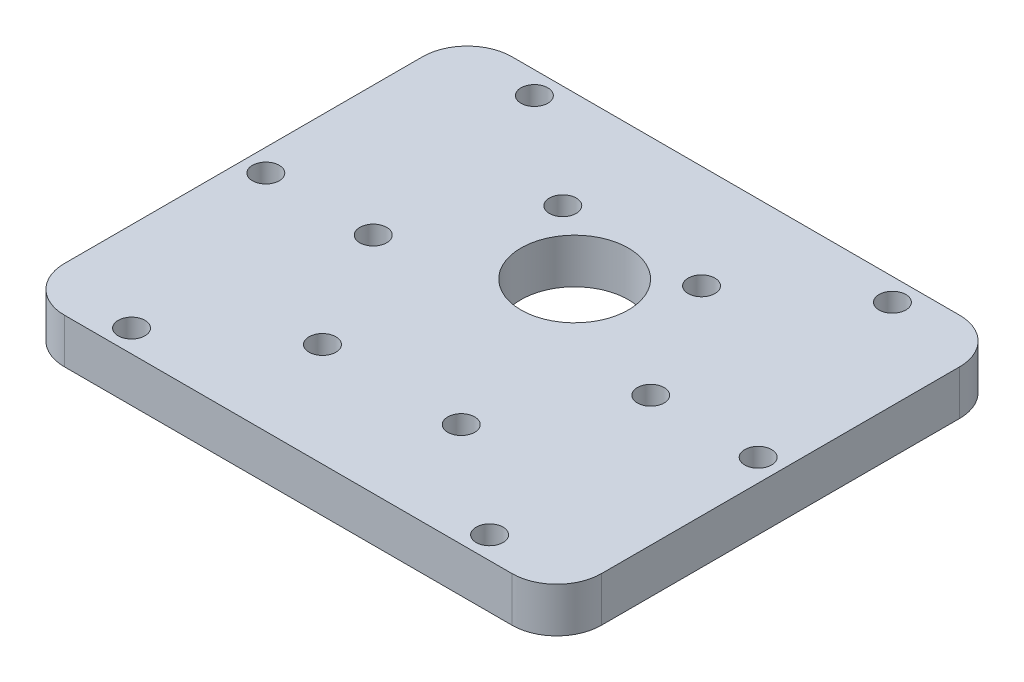
ISO-10303-21;
HEADER;
FILE_DESCRIPTION(('STEP AP214'),'2;1');
FILE_NAME('part.step','',(''),(''),'','','');
FILE_SCHEMA(('AUTOMOTIVE_DESIGN { 1 0 10303 214 1 1 1 1 }'));
ENDSEC;
DATA;
#1=APPLICATION_CONTEXT('core data for automotive mechanical design processes');
#2=APPLICATION_PROTOCOL_DEFINITION('international standard','automotive_design',2000,#1);
#3=PRODUCT_CONTEXT('',#1,'mechanical');
#4=PRODUCT('Part','Part','',(#3));
#5=PRODUCT_RELATED_PRODUCT_CATEGORY('part','',(#4));
#6=PRODUCT_DEFINITION_FORMATION('','',#4);
#7=PRODUCT_DEFINITION_CONTEXT('part definition',#1,'design');
#8=PRODUCT_DEFINITION('design','',#6,#7);
#9=PRODUCT_DEFINITION_SHAPE('','',#8);
#10=(LENGTH_UNIT() NAMED_UNIT(*) SI_UNIT(.MILLI.,.METRE.));
#11=(NAMED_UNIT(*) PLANE_ANGLE_UNIT() SI_UNIT($,.RADIAN.));
#12=(NAMED_UNIT(*) SI_UNIT($,.STERADIAN.) SOLID_ANGLE_UNIT());
#13=UNCERTAINTY_MEASURE_WITH_UNIT(LENGTH_MEASURE(1.E-05),#10,'distance_accuracy_value','');
#14=(GEOMETRIC_REPRESENTATION_CONTEXT(3) GLOBAL_UNCERTAINTY_ASSIGNED_CONTEXT((#13)) GLOBAL_UNIT_ASSIGNED_CONTEXT((#10,
#11,#12)) REPRESENTATION_CONTEXT('',''));
#15=CARTESIAN_POINT('',(0.,0.,0.));
#16=DIRECTION('',(0.,0.,1.));
#17=DIRECTION('',(1.,0.,0.));
#18=AXIS2_PLACEMENT_3D('',#15,#16,#17);
#19=CARTESIAN_POINT('',(30.,5.,-25.));
#20=DIRECTION('',(-1.,0.,0.));
#21=DIRECTION('',(0.,0.,1.));
#22=AXIS2_PLACEMENT_3D('',#19,#20,#21);
#23=PLANE('',#22);
#24=DIRECTION('',(0.,0.,-1.));
#25=VECTOR('',#24,1.);
#26=CARTESIAN_POINT('',(30.,5.,-25.));
#27=LINE('',#26,#25);
#28=CARTESIAN_POINT('',(30.,5.,20.));
#29=VERTEX_POINT('',#28);
#30=CARTESIAN_POINT('',(30.,5.,-20.));
#31=VERTEX_POINT('',#30);
#32=EDGE_CURVE('E134',#29,#31,#27,.T.);
#33=ORIENTED_EDGE('',*,*,#32,.F.);
#34=DIRECTION('',(0.,-1.,0.));
#35=VECTOR('',#34,1.);
#36=CARTESIAN_POINT('',(30.,5.,20.));
#37=LINE('',#36,#35);
#38=CARTESIAN_POINT('',(30.,0.,20.));
#39=VERTEX_POINT('',#38);
#40=EDGE_CURVE('E173',#29,#39,#37,.T.);
#41=ORIENTED_EDGE('',*,*,#40,.T.);
#42=DIRECTION('',(0.,0.,-1.));
#43=VECTOR('',#42,1.);
#44=CARTESIAN_POINT('',(30.,0.,-25.));
#45=LINE('',#44,#43);
#46=CARTESIAN_POINT('',(30.,0.,-20.));
#47=VERTEX_POINT('',#46);
#48=EDGE_CURVE('E188',#39,#47,#45,.T.);
#49=ORIENTED_EDGE('',*,*,#48,.T.);
#50=DIRECTION('',(0.,-1.,0.));
#51=VECTOR('',#50,1.);
#52=CARTESIAN_POINT('',(30.,5.,-20.));
#53=LINE('',#52,#51);
#54=EDGE_CURVE('E170',#47,#31,#53,.F.);
#55=ORIENTED_EDGE('',*,*,#54,.T.);
#56=EDGE_LOOP('',(#33,#41,#49,#55));
#57=FACE_BOUND('',#56,.T.);
#58=ADVANCED_FACE('F38',(#57),#23,.F.);
#59=CARTESIAN_POINT('',(-30.,5.,-25.));
#60=DIRECTION('',(0.,0.,1.));
#61=DIRECTION('',(1.,0.,0.));
#62=AXIS2_PLACEMENT_3D('',#59,#60,#61);
#63=PLANE('',#62);
#64=DIRECTION('',(-1.,0.,0.));
#65=VECTOR('',#64,1.);
#66=CARTESIAN_POINT('',(-30.,5.,-25.));
#67=LINE('',#66,#65);
#68=CARTESIAN_POINT('',(25.,5.,-25.));
#69=VERTEX_POINT('',#68);
#70=CARTESIAN_POINT('',(-25.,5.,-25.));
#71=VERTEX_POINT('',#70);
#72=EDGE_CURVE('E139',#69,#71,#67,.T.);
#73=ORIENTED_EDGE('',*,*,#72,.F.);
#74=DIRECTION('',(0.,-1.,0.));
#75=VECTOR('',#74,1.);
#76=CARTESIAN_POINT('',(25.,5.,-25.));
#77=LINE('',#76,#75);
#78=CARTESIAN_POINT('',(25.,0.,-25.));
#79=VERTEX_POINT('',#78);
#80=EDGE_CURVE('E11',#69,#79,#77,.T.);
#81=ORIENTED_EDGE('',*,*,#80,.T.);
#82=DIRECTION('',(-1.,0.,0.));
#83=VECTOR('',#82,1.);
#84=CARTESIAN_POINT('',(-30.,0.,-25.));
#85=LINE('',#84,#83);
#86=CARTESIAN_POINT('',(-25.,0.,-25.));
#87=VERTEX_POINT('',#86);
#88=EDGE_CURVE('E141',#79,#87,#85,.T.);
#89=ORIENTED_EDGE('',*,*,#88,.T.);
#90=DIRECTION('',(0.,-1.,0.));
#91=VECTOR('',#90,1.);
#92=CARTESIAN_POINT('',(-25.,5.,-25.));
#93=LINE('',#92,#91);
#94=EDGE_CURVE('E47',#87,#71,#93,.F.);
#95=ORIENTED_EDGE('',*,*,#94,.T.);
#96=EDGE_LOOP('',(#73,#81,#89,#95));
#97=FACE_BOUND('',#96,.T.);
#98=ADVANCED_FACE('F194',(#97),#63,.F.);
#99=CARTESIAN_POINT('',(-30.,5.,-25.));
#100=DIRECTION('',(1.,0.,0.));
#101=DIRECTION('',(0.,0.,-1.));
#102=AXIS2_PLACEMENT_3D('',#99,#100,#101);
#103=PLANE('',#102);
#104=DIRECTION('',(0.,0.,1.));
#105=VECTOR('',#104,1.);
#106=CARTESIAN_POINT('',(-30.,0.,-25.));
#107=LINE('',#106,#105);
#108=CARTESIAN_POINT('',(-30.,0.,-20.));
#109=VERTEX_POINT('',#108);
#110=CARTESIAN_POINT('',(-30.,0.,20.));
#111=VERTEX_POINT('',#110);
#112=EDGE_CURVE('E135',#109,#111,#107,.T.);
#113=ORIENTED_EDGE('',*,*,#112,.T.);
#114=DIRECTION('',(0.,-1.,0.));
#115=VECTOR('',#114,1.);
#116=CARTESIAN_POINT('',(-30.,5.,20.));
#117=LINE('',#116,#115);
#118=CARTESIAN_POINT('',(-30.,5.,20.));
#119=VERTEX_POINT('',#118);
#120=EDGE_CURVE('E110',#111,#119,#117,.F.);
#121=ORIENTED_EDGE('',*,*,#120,.T.);
#122=DIRECTION('',(0.,0.,1.));
#123=VECTOR('',#122,1.);
#124=CARTESIAN_POINT('',(-30.,5.,-25.));
#125=LINE('',#124,#123);
#126=CARTESIAN_POINT('',(-30.,5.,-20.));
#127=VERTEX_POINT('',#126);
#128=EDGE_CURVE('E179',#127,#119,#125,.T.);
#129=ORIENTED_EDGE('',*,*,#128,.F.);
#130=DIRECTION('',(0.,-1.,0.));
#131=VECTOR('',#130,1.);
#132=CARTESIAN_POINT('',(-30.,5.,-20.));
#133=LINE('',#132,#131);
#134=EDGE_CURVE('E116',#127,#109,#133,.T.);
#135=ORIENTED_EDGE('',*,*,#134,.T.);
#136=EDGE_LOOP('',(#113,#121,#129,#135));
#137=FACE_BOUND('',#136,.T.);
#138=ADVANCED_FACE('F201',(#137),#103,.F.);
#139=CARTESIAN_POINT('',(-30.,5.,25.));
#140=DIRECTION('',(0.,0.,-1.));
#141=DIRECTION('',(-1.,0.,0.));
#142=AXIS2_PLACEMENT_3D('',#139,#140,#141);
#143=PLANE('',#142);
#144=DIRECTION('',(1.,0.,0.));
#145=VECTOR('',#144,1.);
#146=CARTESIAN_POINT('',(-30.,5.,25.));
#147=LINE('',#146,#145);
#148=CARTESIAN_POINT('',(-25.,5.,25.));
#149=VERTEX_POINT('',#148);
#150=CARTESIAN_POINT('',(25.,5.,25.));
#151=VERTEX_POINT('',#150);
#152=EDGE_CURVE('E126',#149,#151,#147,.T.);
#153=ORIENTED_EDGE('',*,*,#152,.F.);
#154=DIRECTION('',(0.,-1.,0.));
#155=VECTOR('',#154,1.);
#156=CARTESIAN_POINT('',(-25.,5.,25.));
#157=LINE('',#156,#155);
#158=CARTESIAN_POINT('',(-25.,0.,25.));
#159=VERTEX_POINT('',#158);
#160=EDGE_CURVE('E109',#149,#159,#157,.T.);
#161=ORIENTED_EDGE('',*,*,#160,.T.);
#162=DIRECTION('',(1.,0.,0.));
#163=VECTOR('',#162,1.);
#164=CARTESIAN_POINT('',(-30.,0.,25.));
#165=LINE('',#164,#163);
#166=CARTESIAN_POINT('',(25.,0.,25.));
#167=VERTEX_POINT('',#166);
#168=EDGE_CURVE('E123',#159,#167,#165,.T.);
#169=ORIENTED_EDGE('',*,*,#168,.T.);
#170=DIRECTION('',(0.,-1.,0.));
#171=VECTOR('',#170,1.);
#172=CARTESIAN_POINT('',(25.,5.,25.));
#173=LINE('',#172,#171);
#174=EDGE_CURVE('E129',#167,#151,#173,.F.);
#175=ORIENTED_EDGE('',*,*,#174,.T.);
#176=EDGE_LOOP('',(#153,#161,#169,#175));
#177=FACE_BOUND('',#176,.T.);
#178=ADVANCED_FACE('F122',(#177),#143,.F.);
#179=CARTESIAN_POINT('',(0.,5.,0.));
#180=DIRECTION('',(0.,1.,0.));
#181=DIRECTION('',(0.,0.,1.));
#182=AXIS2_PLACEMENT_3D('',#179,#180,#181);
#183=PLANE('',#182);
#184=CARTESIAN_POINT('',(15.5,5.,0.));
#185=DIRECTION('',(0.,1.,0.));
#186=DIRECTION('',(0.,0.,1.));
#187=AXIS2_PLACEMENT_3D('',#184,#185,#186);
#188=CIRCLE('',#187,1.5);
#189=CARTESIAN_POINT('',(15.5,5.,1.5));
#190=VERTEX_POINT('',#189);
#191=EDGE_CURVE('E427',#190,#190,#188,.T.);
#192=ORIENTED_EDGE('',*,*,#191,.F.);
#193=EDGE_LOOP('',(#192));
#194=FACE_BOUND('',#193,.T.);
#195=CARTESIAN_POINT('',(7.74999999999997,5.,13.4233937586588));
#196=DIRECTION('',(0.,1.,0.));
#197=DIRECTION('',(0.,0.,1.));
#198=AXIS2_PLACEMENT_3D('',#195,#196,#197);
#199=CIRCLE('',#198,1.5);
#200=CARTESIAN_POINT('',(7.74999999999997,5.,14.9233937586588));
#201=VERTEX_POINT('',#200);
#202=EDGE_CURVE('E433',#201,#201,#199,.T.);
#203=ORIENTED_EDGE('',*,*,#202,.F.);
#204=EDGE_LOOP('',(#203));
#205=FACE_BOUND('',#204,.T.);
#206=CARTESIAN_POINT('',(-7.75000000000006,5.,13.4233937586588));
#207=DIRECTION('',(0.,1.,0.));
#208=DIRECTION('',(0.,0.,1.));
#209=AXIS2_PLACEMENT_3D('',#206,#207,#208);
#210=CIRCLE('',#209,1.5);
#211=CARTESIAN_POINT('',(-7.75000000000006,5.,14.9233937586588));
#212=VERTEX_POINT('',#211);
#213=EDGE_CURVE('E492',#212,#212,#210,.T.);
#214=ORIENTED_EDGE('',*,*,#213,.F.);
#215=EDGE_LOOP('',(#214));
#216=FACE_BOUND('',#215,.T.);
#217=CARTESIAN_POINT('',(-20.,5.,22.5));
#218=DIRECTION('',(0.,1.,0.));
#219=DIRECTION('',(0.,0.,1.));
#220=AXIS2_PLACEMENT_3D('',#217,#218,#219);
#221=CIRCLE('',#220,1.5);
#222=CARTESIAN_POINT('',(-20.,5.,24.));
#223=VERTEX_POINT('',#222);
#224=EDGE_CURVE('E484',#223,#223,#221,.T.);
#225=ORIENTED_EDGE('',*,*,#224,.F.);
#226=EDGE_LOOP('',(#225));
#227=FACE_BOUND('',#226,.T.);
#228=CARTESIAN_POINT('',(-15.5,5.,0.));
#229=DIRECTION('',(0.,1.,0.));
#230=DIRECTION('',(0.,0.,1.));
#231=AXIS2_PLACEMENT_3D('',#228,#229,#230);
#232=CIRCLE('',#231,1.5);
#233=CARTESIAN_POINT('',(-15.5,5.,1.5));
#234=VERTEX_POINT('',#233);
#235=EDGE_CURVE('E469',#234,#234,#232,.T.);
#236=ORIENTED_EDGE('',*,*,#235,.F.);
#237=EDGE_LOOP('',(#236));
#238=FACE_BOUND('',#237,.T.);
#239=CARTESIAN_POINT('',(-7.74999999999997,5.,-13.4233937586588));
#240=DIRECTION('',(0.,1.,0.));
#241=DIRECTION('',(0.,0.,1.));
#242=AXIS2_PLACEMENT_3D('',#239,#240,#241);
#243=CIRCLE('',#242,1.5);
#244=CARTESIAN_POINT('',(-7.74999999999997,5.,-11.9233937586588));
#245=VERTEX_POINT('',#244);
#246=EDGE_CURVE('E461',#245,#245,#243,.T.);
#247=ORIENTED_EDGE('',*,*,#246,.F.);
#248=EDGE_LOOP('',(#247));
#249=FACE_BOUND('',#248,.T.);
#250=CARTESIAN_POINT('',(0.,5.,-7.));
#251=DIRECTION('',(0.,1.,0.));
#252=DIRECTION('',(0.,0.,1.));
#253=AXIS2_PLACEMENT_3D('',#250,#251,#252);
#254=CIRCLE('',#253,6.);
#255=CARTESIAN_POINT('',(0.,5.,-0.999999999999999));
#256=VERTEX_POINT('',#255);
#257=EDGE_CURVE('E453',#256,#256,#254,.T.);
#258=ORIENTED_EDGE('',*,*,#257,.F.);
#259=EDGE_LOOP('',(#258));
#260=FACE_BOUND('',#259,.T.);
#261=CARTESIAN_POINT('',(20.,5.,22.5));
#262=DIRECTION('',(0.,1.,0.));
#263=DIRECTION('',(0.,0.,1.));
#264=AXIS2_PLACEMENT_3D('',#261,#262,#263);
#265=CIRCLE('',#264,1.5);
#266=CARTESIAN_POINT('',(20.,5.,24.));
#267=VERTEX_POINT('',#266);
#268=EDGE_CURVE('E445',#267,#267,#265,.T.);
#269=ORIENTED_EDGE('',*,*,#268,.F.);
#270=EDGE_LOOP('',(#269));
#271=FACE_BOUND('',#270,.T.);
#272=CARTESIAN_POINT('',(7.75000000000006,5.,-13.4233937586588));
#273=DIRECTION('',(0.,1.,0.));
#274=DIRECTION('',(0.,0.,1.));
#275=AXIS2_PLACEMENT_3D('',#272,#273,#274);
#276=CIRCLE('',#275,1.5);
#277=CARTESIAN_POINT('',(7.75000000000006,5.,-11.9233937586588));
#278=VERTEX_POINT('',#277);
#279=EDGE_CURVE('E436',#278,#278,#276,.T.);
#280=ORIENTED_EDGE('',*,*,#279,.F.);
#281=EDGE_LOOP('',(#280));
#282=FACE_BOUND('',#281,.T.);
#283=CARTESIAN_POINT('',(-20.,5.,-22.5));
#284=DIRECTION('',(0.,1.,0.));
#285=DIRECTION('',(0.,0.,1.));
#286=AXIS2_PLACEMENT_3D('',#283,#284,#285);
#287=CIRCLE('',#286,1.5);
#288=CARTESIAN_POINT('',(-20.,5.,-21.));
#289=VERTEX_POINT('',#288);
#290=EDGE_CURVE('E521',#289,#289,#287,.T.);
#291=ORIENTED_EDGE('',*,*,#290,.F.);
#292=EDGE_LOOP('',(#291));
#293=FACE_BOUND('',#292,.T.);
#294=CARTESIAN_POINT('',(-27.5,5.,0.));
#295=DIRECTION('',(0.,1.,0.));
#296=DIRECTION('',(0.,0.,1.));
#297=AXIS2_PLACEMENT_3D('',#294,#295,#296);
#298=CIRCLE('',#297,1.5);
#299=CARTESIAN_POINT('',(-27.5,5.,1.5));
#300=VERTEX_POINT('',#299);
#301=EDGE_CURVE('E513',#300,#300,#298,.T.);
#302=ORIENTED_EDGE('',*,*,#301,.F.);
#303=EDGE_LOOP('',(#302));
#304=FACE_BOUND('',#303,.T.);
#305=CARTESIAN_POINT('',(27.5,5.,0.));
#306=DIRECTION('',(0.,1.,0.));
#307=DIRECTION('',(0.,0.,1.));
#308=AXIS2_PLACEMENT_3D('',#305,#306,#307);
#309=CIRCLE('',#308,1.5);
#310=CARTESIAN_POINT('',(27.5,5.,1.5));
#311=VERTEX_POINT('',#310);
#312=EDGE_CURVE('E505',#311,#311,#309,.T.);
#313=ORIENTED_EDGE('',*,*,#312,.F.);
#314=EDGE_LOOP('',(#313));
#315=FACE_BOUND('',#314,.T.);
#316=CARTESIAN_POINT('',(20.,5.,-22.5));
#317=DIRECTION('',(0.,1.,0.));
#318=DIRECTION('',(0.,0.,1.));
#319=AXIS2_PLACEMENT_3D('',#316,#317,#318);
#320=CIRCLE('',#319,1.5);
#321=CARTESIAN_POINT('',(20.,5.,-21.));
#322=VERTEX_POINT('',#321);
#323=EDGE_CURVE('E444',#322,#322,#320,.T.);
#324=ORIENTED_EDGE('',*,*,#323,.F.);
#325=EDGE_LOOP('',(#324));
#326=FACE_BOUND('',#325,.T.);
#327=ORIENTED_EDGE('',*,*,#128,.T.);
#328=CARTESIAN_POINT('',(-25.,5.,20.));
#329=DIRECTION('',(0.,1.,0.));
#330=DIRECTION('',(0.,0.,1.));
#331=AXIS2_PLACEMENT_3D('',#328,#329,#330);
#332=CIRCLE('',#331,5.);
#333=EDGE_CURVE('E167',#119,#149,#332,.T.);
#334=ORIENTED_EDGE('',*,*,#333,.T.);
#335=ORIENTED_EDGE('',*,*,#152,.T.);
#336=CARTESIAN_POINT('',(25.,5.,20.));
#337=DIRECTION('',(0.,1.,0.));
#338=DIRECTION('',(0.,0.,1.));
#339=AXIS2_PLACEMENT_3D('',#336,#337,#338);
#340=CIRCLE('',#339,5.);
#341=EDGE_CURVE('E164',#151,#29,#340,.T.);
#342=ORIENTED_EDGE('',*,*,#341,.T.);
#343=ORIENTED_EDGE('',*,*,#32,.T.);
#344=CARTESIAN_POINT('',(25.,5.,-20.));
#345=DIRECTION('',(0.,1.,0.));
#346=DIRECTION('',(0.,0.,1.));
#347=AXIS2_PLACEMENT_3D('',#344,#345,#346);
#348=CIRCLE('',#347,5.);
#349=EDGE_CURVE('E60',#31,#69,#348,.T.);
#350=ORIENTED_EDGE('',*,*,#349,.T.);
#351=ORIENTED_EDGE('',*,*,#72,.T.);
#352=CARTESIAN_POINT('',(-25.,5.,-20.));
#353=DIRECTION('',(0.,1.,0.));
#354=DIRECTION('',(0.,0.,1.));
#355=AXIS2_PLACEMENT_3D('',#352,#353,#354);
#356=CIRCLE('',#355,5.);
#357=EDGE_CURVE('E159',#71,#127,#356,.T.);
#358=ORIENTED_EDGE('',*,*,#357,.T.);
#359=EDGE_LOOP('',(#327,#334,#335,#342,#343,#350,#351,#358));
#360=FACE_BOUND('',#359,.T.);
#361=ADVANCED_FACE('F199',(#194,#205,#216,#227,#238,#249,#260,#271,#282,#293,#304,#315,#326,
#360),#183,.T.);
#362=CARTESIAN_POINT('',(0.,0.,0.));
#363=DIRECTION('',(0.,1.,0.));
#364=DIRECTION('',(0.,0.,1.));
#365=AXIS2_PLACEMENT_3D('',#362,#363,#364);
#366=PLANE('',#365);
#367=CARTESIAN_POINT('',(15.5,0.,0.));
#368=DIRECTION('',(0.,1.,0.));
#369=DIRECTION('',(0.,0.,1.));
#370=AXIS2_PLACEMENT_3D('',#367,#368,#369);
#371=CIRCLE('',#370,1.5);
#372=CARTESIAN_POINT('',(15.5,0.,1.5));
#373=VERTEX_POINT('',#372);
#374=EDGE_CURVE('E424',#373,#373,#371,.T.);
#375=ORIENTED_EDGE('',*,*,#374,.T.);
#376=EDGE_LOOP('',(#375));
#377=FACE_BOUND('',#376,.T.);
#378=CARTESIAN_POINT('',(7.74999999999997,0.,13.4233937586588));
#379=DIRECTION('',(0.,1.,0.));
#380=DIRECTION('',(0.,0.,1.));
#381=AXIS2_PLACEMENT_3D('',#378,#379,#380);
#382=CIRCLE('',#381,1.5);
#383=CARTESIAN_POINT('',(7.74999999999997,0.,14.9233937586588));
#384=VERTEX_POINT('',#383);
#385=EDGE_CURVE('E496',#384,#384,#382,.T.);
#386=ORIENTED_EDGE('',*,*,#385,.T.);
#387=EDGE_LOOP('',(#386));
#388=FACE_BOUND('',#387,.T.);
#389=CARTESIAN_POINT('',(-7.75000000000006,0.,13.4233937586588));
#390=DIRECTION('',(0.,1.,0.));
#391=DIRECTION('',(0.,0.,1.));
#392=AXIS2_PLACEMENT_3D('',#389,#390,#391);
#393=CIRCLE('',#392,1.5);
#394=CARTESIAN_POINT('',(-7.75000000000006,0.,14.9233937586588));
#395=VERTEX_POINT('',#394);
#396=EDGE_CURVE('E488',#395,#395,#393,.T.);
#397=ORIENTED_EDGE('',*,*,#396,.T.);
#398=EDGE_LOOP('',(#397));
#399=FACE_BOUND('',#398,.T.);
#400=CARTESIAN_POINT('',(-20.,0.,22.5));
#401=DIRECTION('',(0.,1.,0.));
#402=DIRECTION('',(0.,0.,1.));
#403=AXIS2_PLACEMENT_3D('',#400,#401,#402);
#404=CIRCLE('',#403,1.5);
#405=CARTESIAN_POINT('',(-20.,0.,24.));
#406=VERTEX_POINT('',#405);
#407=EDGE_CURVE('E473',#406,#406,#404,.T.);
#408=ORIENTED_EDGE('',*,*,#407,.T.);
#409=EDGE_LOOP('',(#408));
#410=FACE_BOUND('',#409,.T.);
#411=CARTESIAN_POINT('',(-15.5,0.,0.));
#412=DIRECTION('',(0.,1.,0.));
#413=DIRECTION('',(0.,0.,1.));
#414=AXIS2_PLACEMENT_3D('',#411,#412,#413);
#415=CIRCLE('',#414,1.5);
#416=CARTESIAN_POINT('',(-15.5,0.,1.5));
#417=VERTEX_POINT('',#416);
#418=EDGE_CURVE('E465',#417,#417,#415,.T.);
#419=ORIENTED_EDGE('',*,*,#418,.T.);
#420=EDGE_LOOP('',(#419));
#421=FACE_BOUND('',#420,.T.);
#422=CARTESIAN_POINT('',(-7.74999999999997,0.,-13.4233937586588));
#423=DIRECTION('',(0.,1.,0.));
#424=DIRECTION('',(0.,0.,1.));
#425=AXIS2_PLACEMENT_3D('',#422,#423,#424);
#426=CIRCLE('',#425,1.5);
#427=CARTESIAN_POINT('',(-7.74999999999997,0.,-11.9233937586588));
#428=VERTEX_POINT('',#427);
#429=EDGE_CURVE('E457',#428,#428,#426,.T.);
#430=ORIENTED_EDGE('',*,*,#429,.T.);
#431=EDGE_LOOP('',(#430));
#432=FACE_BOUND('',#431,.T.);
#433=CARTESIAN_POINT('',(0.,0.,-7.));
#434=DIRECTION('',(0.,1.,0.));
#435=DIRECTION('',(0.,0.,1.));
#436=AXIS2_PLACEMENT_3D('',#433,#434,#435);
#437=CIRCLE('',#436,6.);
#438=CARTESIAN_POINT('',(0.,0.,-0.999999999999999));
#439=VERTEX_POINT('',#438);
#440=EDGE_CURVE('E449',#439,#439,#437,.T.);
#441=ORIENTED_EDGE('',*,*,#440,.T.);
#442=EDGE_LOOP('',(#441));
#443=FACE_BOUND('',#442,.T.);
#444=CARTESIAN_POINT('',(20.,0.,22.5));
#445=DIRECTION('',(0.,1.,0.));
#446=DIRECTION('',(0.,0.,1.));
#447=AXIS2_PLACEMENT_3D('',#444,#445,#446);
#448=CIRCLE('',#447,1.5);
#449=CARTESIAN_POINT('',(20.,0.,24.));
#450=VERTEX_POINT('',#449);
#451=EDGE_CURVE('E440',#450,#450,#448,.T.);
#452=ORIENTED_EDGE('',*,*,#451,.T.);
#453=EDGE_LOOP('',(#452));
#454=FACE_BOUND('',#453,.T.);
#455=CARTESIAN_POINT('',(7.75000000000006,0.,-13.4233937586588));
#456=DIRECTION('',(0.,1.,0.));
#457=DIRECTION('',(0.,0.,1.));
#458=AXIS2_PLACEMENT_3D('',#455,#456,#457);
#459=CIRCLE('',#458,1.5);
#460=CARTESIAN_POINT('',(7.75000000000006,0.,-11.9233937586588));
#461=VERTEX_POINT('',#460);
#462=EDGE_CURVE('E429',#461,#461,#459,.T.);
#463=ORIENTED_EDGE('',*,*,#462,.T.);
#464=EDGE_LOOP('',(#463));
#465=FACE_BOUND('',#464,.T.);
#466=CARTESIAN_POINT('',(-20.,0.,-22.5));
#467=DIRECTION('',(0.,1.,0.));
#468=DIRECTION('',(0.,0.,1.));
#469=AXIS2_PLACEMENT_3D('',#466,#467,#468);
#470=CIRCLE('',#469,1.5);
#471=CARTESIAN_POINT('',(-20.,0.,-21.));
#472=VERTEX_POINT('',#471);
#473=EDGE_CURVE('E525',#472,#472,#470,.T.);
#474=ORIENTED_EDGE('',*,*,#473,.T.);
#475=EDGE_LOOP('',(#474));
#476=FACE_BOUND('',#475,.T.);
#477=CARTESIAN_POINT('',(-27.5,0.,0.));
#478=DIRECTION('',(0.,1.,0.));
#479=DIRECTION('',(0.,0.,1.));
#480=AXIS2_PLACEMENT_3D('',#477,#478,#479);
#481=CIRCLE('',#480,1.5);
#482=CARTESIAN_POINT('',(-27.5,0.,1.5));
#483=VERTEX_POINT('',#482);
#484=EDGE_CURVE('E517',#483,#483,#481,.T.);
#485=ORIENTED_EDGE('',*,*,#484,.T.);
#486=EDGE_LOOP('',(#485));
#487=FACE_BOUND('',#486,.T.);
#488=CARTESIAN_POINT('',(27.5,0.,0.));
#489=DIRECTION('',(0.,1.,0.));
#490=DIRECTION('',(0.,0.,1.));
#491=AXIS2_PLACEMENT_3D('',#488,#489,#490);
#492=CIRCLE('',#491,1.5);
#493=CARTESIAN_POINT('',(27.5,0.,1.5));
#494=VERTEX_POINT('',#493);
#495=EDGE_CURVE('E509',#494,#494,#492,.T.);
#496=ORIENTED_EDGE('',*,*,#495,.T.);
#497=EDGE_LOOP('',(#496));
#498=FACE_BOUND('',#497,.T.);
#499=CARTESIAN_POINT('',(20.,0.,-22.5));
#500=DIRECTION('',(0.,1.,0.));
#501=DIRECTION('',(0.,0.,1.));
#502=AXIS2_PLACEMENT_3D('',#499,#500,#501);
#503=CIRCLE('',#502,1.5);
#504=CARTESIAN_POINT('',(20.,0.,-21.));
#505=VERTEX_POINT('',#504);
#506=EDGE_CURVE('E191',#505,#505,#503,.T.);
#507=ORIENTED_EDGE('',*,*,#506,.T.);
#508=EDGE_LOOP('',(#507));
#509=FACE_BOUND('',#508,.T.);
#510=ORIENTED_EDGE('',*,*,#168,.F.);
#511=CARTESIAN_POINT('',(-25.,0.,20.));
#512=DIRECTION('',(0.,1.,0.));
#513=DIRECTION('',(0.,0.,1.));
#514=AXIS2_PLACEMENT_3D('',#511,#512,#513);
#515=CIRCLE('',#514,5.);
#516=EDGE_CURVE('E105',#159,#111,#515,.F.);
#517=ORIENTED_EDGE('',*,*,#516,.T.);
#518=ORIENTED_EDGE('',*,*,#112,.F.);
#519=CARTESIAN_POINT('',(-25.,0.,-20.));
#520=DIRECTION('',(0.,1.,0.));
#521=DIRECTION('',(0.,0.,1.));
#522=AXIS2_PLACEMENT_3D('',#519,#520,#521);
#523=CIRCLE('',#522,5.);
#524=EDGE_CURVE('E128',#109,#87,#523,.F.);
#525=ORIENTED_EDGE('',*,*,#524,.T.);
#526=ORIENTED_EDGE('',*,*,#88,.F.);
#527=CARTESIAN_POINT('',(25.,0.,-20.));
#528=DIRECTION('',(0.,1.,0.));
#529=DIRECTION('',(0.,0.,1.));
#530=AXIS2_PLACEMENT_3D('',#527,#528,#529);
#531=CIRCLE('',#530,5.);
#532=EDGE_CURVE('E149',#79,#47,#531,.F.);
#533=ORIENTED_EDGE('',*,*,#532,.T.);
#534=ORIENTED_EDGE('',*,*,#48,.F.);
#535=CARTESIAN_POINT('',(25.,0.,20.));
#536=DIRECTION('',(0.,1.,0.));
#537=DIRECTION('',(0.,0.,1.));
#538=AXIS2_PLACEMENT_3D('',#535,#536,#537);
#539=CIRCLE('',#538,5.);
#540=EDGE_CURVE('E117',#39,#167,#539,.F.);
#541=ORIENTED_EDGE('',*,*,#540,.T.);
#542=EDGE_LOOP('',(#510,#517,#518,#525,#526,#533,#534,#541));
#543=FACE_BOUND('',#542,.T.);
#544=ADVANCED_FACE('F131',(#377,#388,#399,#410,#421,#432,#443,#454,#465,#476,#487,#498,#509,
#543),#366,.F.);
#545=CARTESIAN_POINT('',(20.,0.,-22.5));
#546=DIRECTION('',(0.,1.,0.));
#547=DIRECTION('',(0.,0.,1.));
#548=AXIS2_PLACEMENT_3D('',#545,#546,#547);
#549=CYLINDRICAL_SURFACE('',#548,1.5);
#550=ORIENTED_EDGE('',*,*,#506,.F.);
#551=EDGE_LOOP('',(#550));
#552=FACE_BOUND('',#551,.T.);
#553=ORIENTED_EDGE('',*,*,#323,.T.);
#554=EDGE_LOOP('',(#553));
#555=FACE_BOUND('',#554,.T.);
#556=ADVANCED_FACE('F261',(#552,#555),#549,.F.);
#557=CARTESIAN_POINT('',(27.5,0.,0.));
#558=DIRECTION('',(0.,1.,0.));
#559=DIRECTION('',(0.,0.,1.));
#560=AXIS2_PLACEMENT_3D('',#557,#558,#559);
#561=CYLINDRICAL_SURFACE('',#560,1.5);
#562=ORIENTED_EDGE('',*,*,#495,.F.);
#563=EDGE_LOOP('',(#562));
#564=FACE_BOUND('',#563,.T.);
#565=ORIENTED_EDGE('',*,*,#312,.T.);
#566=EDGE_LOOP('',(#565));
#567=FACE_BOUND('',#566,.T.);
#568=ADVANCED_FACE('F302',(#564,#567),#561,.F.);
#569=CARTESIAN_POINT('',(-27.5,0.,0.));
#570=DIRECTION('',(0.,1.,0.));
#571=DIRECTION('',(0.,0.,1.));
#572=AXIS2_PLACEMENT_3D('',#569,#570,#571);
#573=CYLINDRICAL_SURFACE('',#572,1.5);
#574=ORIENTED_EDGE('',*,*,#484,.F.);
#575=EDGE_LOOP('',(#574));
#576=FACE_BOUND('',#575,.T.);
#577=ORIENTED_EDGE('',*,*,#301,.T.);
#578=EDGE_LOOP('',(#577));
#579=FACE_BOUND('',#578,.T.);
#580=ADVANCED_FACE('F311',(#576,#579),#573,.F.);
#581=CARTESIAN_POINT('',(-20.,0.,-22.5));
#582=DIRECTION('',(0.,1.,0.));
#583=DIRECTION('',(0.,0.,1.));
#584=AXIS2_PLACEMENT_3D('',#581,#582,#583);
#585=CYLINDRICAL_SURFACE('',#584,1.5);
#586=ORIENTED_EDGE('',*,*,#473,.F.);
#587=EDGE_LOOP('',(#586));
#588=FACE_BOUND('',#587,.T.);
#589=ORIENTED_EDGE('',*,*,#290,.T.);
#590=EDGE_LOOP('',(#589));
#591=FACE_BOUND('',#590,.T.);
#592=ADVANCED_FACE('F320',(#588,#591),#585,.F.);
#593=CARTESIAN_POINT('',(7.75000000000006,0.,-13.4233937586588));
#594=DIRECTION('',(0.,1.,0.));
#595=DIRECTION('',(0.,0.,1.));
#596=AXIS2_PLACEMENT_3D('',#593,#594,#595);
#597=CYLINDRICAL_SURFACE('',#596,1.5);
#598=ORIENTED_EDGE('',*,*,#462,.F.);
#599=EDGE_LOOP('',(#598));
#600=FACE_BOUND('',#599,.T.);
#601=ORIENTED_EDGE('',*,*,#279,.T.);
#602=EDGE_LOOP('',(#601));
#603=FACE_BOUND('',#602,.T.);
#604=ADVANCED_FACE('F329',(#600,#603),#597,.F.);
#605=CARTESIAN_POINT('',(20.,0.,22.5));
#606=DIRECTION('',(0.,1.,0.));
#607=DIRECTION('',(0.,0.,1.));
#608=AXIS2_PLACEMENT_3D('',#605,#606,#607);
#609=CYLINDRICAL_SURFACE('',#608,1.5);
#610=ORIENTED_EDGE('',*,*,#451,.F.);
#611=EDGE_LOOP('',(#610));
#612=FACE_BOUND('',#611,.T.);
#613=ORIENTED_EDGE('',*,*,#268,.T.);
#614=EDGE_LOOP('',(#613));
#615=FACE_BOUND('',#614,.T.);
#616=ADVANCED_FACE('F338',(#612,#615),#609,.F.);
#617=CARTESIAN_POINT('',(0.,0.,-7.));
#618=DIRECTION('',(0.,1.,0.));
#619=DIRECTION('',(0.,0.,1.));
#620=AXIS2_PLACEMENT_3D('',#617,#618,#619);
#621=CYLINDRICAL_SURFACE('',#620,6.);
#622=ORIENTED_EDGE('',*,*,#440,.F.);
#623=EDGE_LOOP('',(#622));
#624=FACE_BOUND('',#623,.T.);
#625=ORIENTED_EDGE('',*,*,#257,.T.);
#626=EDGE_LOOP('',(#625));
#627=FACE_BOUND('',#626,.T.);
#628=ADVANCED_FACE('F347',(#624,#627),#621,.F.);
#629=CARTESIAN_POINT('',(-7.74999999999997,0.,-13.4233937586588));
#630=DIRECTION('',(0.,1.,0.));
#631=DIRECTION('',(0.,0.,1.));
#632=AXIS2_PLACEMENT_3D('',#629,#630,#631);
#633=CYLINDRICAL_SURFACE('',#632,1.5);
#634=ORIENTED_EDGE('',*,*,#429,.F.);
#635=EDGE_LOOP('',(#634));
#636=FACE_BOUND('',#635,.T.);
#637=ORIENTED_EDGE('',*,*,#246,.T.);
#638=EDGE_LOOP('',(#637));
#639=FACE_BOUND('',#638,.T.);
#640=ADVANCED_FACE('F356',(#636,#639),#633,.F.);
#641=CARTESIAN_POINT('',(-15.5,0.,0.));
#642=DIRECTION('',(0.,1.,0.));
#643=DIRECTION('',(0.,0.,1.));
#644=AXIS2_PLACEMENT_3D('',#641,#642,#643);
#645=CYLINDRICAL_SURFACE('',#644,1.5);
#646=ORIENTED_EDGE('',*,*,#418,.F.);
#647=EDGE_LOOP('',(#646));
#648=FACE_BOUND('',#647,.T.);
#649=ORIENTED_EDGE('',*,*,#235,.T.);
#650=EDGE_LOOP('',(#649));
#651=FACE_BOUND('',#650,.T.);
#652=ADVANCED_FACE('F365',(#648,#651),#645,.F.);
#653=CARTESIAN_POINT('',(-20.,0.,22.5));
#654=DIRECTION('',(0.,1.,0.));
#655=DIRECTION('',(0.,0.,1.));
#656=AXIS2_PLACEMENT_3D('',#653,#654,#655);
#657=CYLINDRICAL_SURFACE('',#656,1.5);
#658=ORIENTED_EDGE('',*,*,#407,.F.);
#659=EDGE_LOOP('',(#658));
#660=FACE_BOUND('',#659,.T.);
#661=ORIENTED_EDGE('',*,*,#224,.T.);
#662=EDGE_LOOP('',(#661));
#663=FACE_BOUND('',#662,.T.);
#664=ADVANCED_FACE('F374',(#660,#663),#657,.F.);
#665=CARTESIAN_POINT('',(-7.75000000000006,0.,13.4233937586588));
#666=DIRECTION('',(0.,1.,0.));
#667=DIRECTION('',(0.,0.,1.));
#668=AXIS2_PLACEMENT_3D('',#665,#666,#667);
#669=CYLINDRICAL_SURFACE('',#668,1.5);
#670=ORIENTED_EDGE('',*,*,#396,.F.);
#671=EDGE_LOOP('',(#670));
#672=FACE_BOUND('',#671,.T.);
#673=ORIENTED_EDGE('',*,*,#213,.T.);
#674=EDGE_LOOP('',(#673));
#675=FACE_BOUND('',#674,.T.);
#676=ADVANCED_FACE('F383',(#672,#675),#669,.F.);
#677=CARTESIAN_POINT('',(7.74999999999997,0.,13.4233937586588));
#678=DIRECTION('',(0.,1.,0.));
#679=DIRECTION('',(0.,0.,1.));
#680=AXIS2_PLACEMENT_3D('',#677,#678,#679);
#681=CYLINDRICAL_SURFACE('',#680,1.5);
#682=ORIENTED_EDGE('',*,*,#385,.F.);
#683=EDGE_LOOP('',(#682));
#684=FACE_BOUND('',#683,.T.);
#685=ORIENTED_EDGE('',*,*,#202,.T.);
#686=EDGE_LOOP('',(#685));
#687=FACE_BOUND('',#686,.T.);
#688=ADVANCED_FACE('F392',(#684,#687),#681,.F.);
#689=CARTESIAN_POINT('',(15.5,0.,0.));
#690=DIRECTION('',(0.,1.,0.));
#691=DIRECTION('',(0.,0.,1.));
#692=AXIS2_PLACEMENT_3D('',#689,#690,#691);
#693=CYLINDRICAL_SURFACE('',#692,1.5);
#694=ORIENTED_EDGE('',*,*,#374,.F.);
#695=EDGE_LOOP('',(#694));
#696=FACE_BOUND('',#695,.T.);
#697=ORIENTED_EDGE('',*,*,#191,.T.);
#698=EDGE_LOOP('',(#697));
#699=FACE_BOUND('',#698,.T.);
#700=ADVANCED_FACE('F221',(#696,#699),#693,.F.);
#701=CARTESIAN_POINT('',(-25.,5.,20.));
#702=DIRECTION('',(0.,-1.,0.));
#703=DIRECTION('',(0.,0.,-1.));
#704=AXIS2_PLACEMENT_3D('',#701,#702,#703);
#705=CYLINDRICAL_SURFACE('',#704,5.);
#706=ORIENTED_EDGE('',*,*,#333,.F.);
#707=ORIENTED_EDGE('',*,*,#120,.F.);
#708=ORIENTED_EDGE('',*,*,#516,.F.);
#709=ORIENTED_EDGE('',*,*,#160,.F.);
#710=EDGE_LOOP('',(#706,#707,#708,#709));
#711=FACE_BOUND('',#710,.T.);
#712=ADVANCED_FACE('F108',(#711),#705,.T.);
#713=CARTESIAN_POINT('',(25.,5.,20.));
#714=DIRECTION('',(0.,-1.,0.));
#715=DIRECTION('',(0.,0.,-1.));
#716=AXIS2_PLACEMENT_3D('',#713,#714,#715);
#717=CYLINDRICAL_SURFACE('',#716,5.);
#718=ORIENTED_EDGE('',*,*,#341,.F.);
#719=ORIENTED_EDGE('',*,*,#174,.F.);
#720=ORIENTED_EDGE('',*,*,#540,.F.);
#721=ORIENTED_EDGE('',*,*,#40,.F.);
#722=EDGE_LOOP('',(#718,#719,#720,#721));
#723=FACE_BOUND('',#722,.T.);
#724=ADVANCED_FACE('F220',(#723),#717,.T.);
#725=CARTESIAN_POINT('',(25.,5.,-20.));
#726=DIRECTION('',(0.,-1.,0.));
#727=DIRECTION('',(0.,0.,-1.));
#728=AXIS2_PLACEMENT_3D('',#725,#726,#727);
#729=CYLINDRICAL_SURFACE('',#728,5.);
#730=ORIENTED_EDGE('',*,*,#349,.F.);
#731=ORIENTED_EDGE('',*,*,#54,.F.);
#732=ORIENTED_EDGE('',*,*,#532,.F.);
#733=ORIENTED_EDGE('',*,*,#80,.F.);
#734=EDGE_LOOP('',(#730,#731,#732,#733));
#735=FACE_BOUND('',#734,.T.);
#736=ADVANCED_FACE('F223',(#735),#729,.T.);
#737=CARTESIAN_POINT('',(-25.,5.,-20.));
#738=DIRECTION('',(0.,-1.,0.));
#739=DIRECTION('',(0.,0.,-1.));
#740=AXIS2_PLACEMENT_3D('',#737,#738,#739);
#741=CYLINDRICAL_SURFACE('',#740,5.);
#742=ORIENTED_EDGE('',*,*,#357,.F.);
#743=ORIENTED_EDGE('',*,*,#94,.F.);
#744=ORIENTED_EDGE('',*,*,#524,.F.);
#745=ORIENTED_EDGE('',*,*,#134,.F.);
#746=EDGE_LOOP('',(#742,#743,#744,#745));
#747=FACE_BOUND('',#746,.T.);
#748=ADVANCED_FACE('F40',(#747),#741,.T.);
#749=CLOSED_SHELL('',(#58,#98,#138,#178,#361,#544,#556,#568,#580,#592,#604,#616,#628,#640,#652,
#664,#676,#688,#700,#712,#724,#736,#748));
#750=MANIFOLD_SOLID_BREP('B2',#749);
#751=ADVANCED_BREP_SHAPE_REPRESENTATION('',(#18,#750),#14);
#752=SHAPE_DEFINITION_REPRESENTATION(#9,#751);
ENDSEC;
END-ISO-10303-21;
